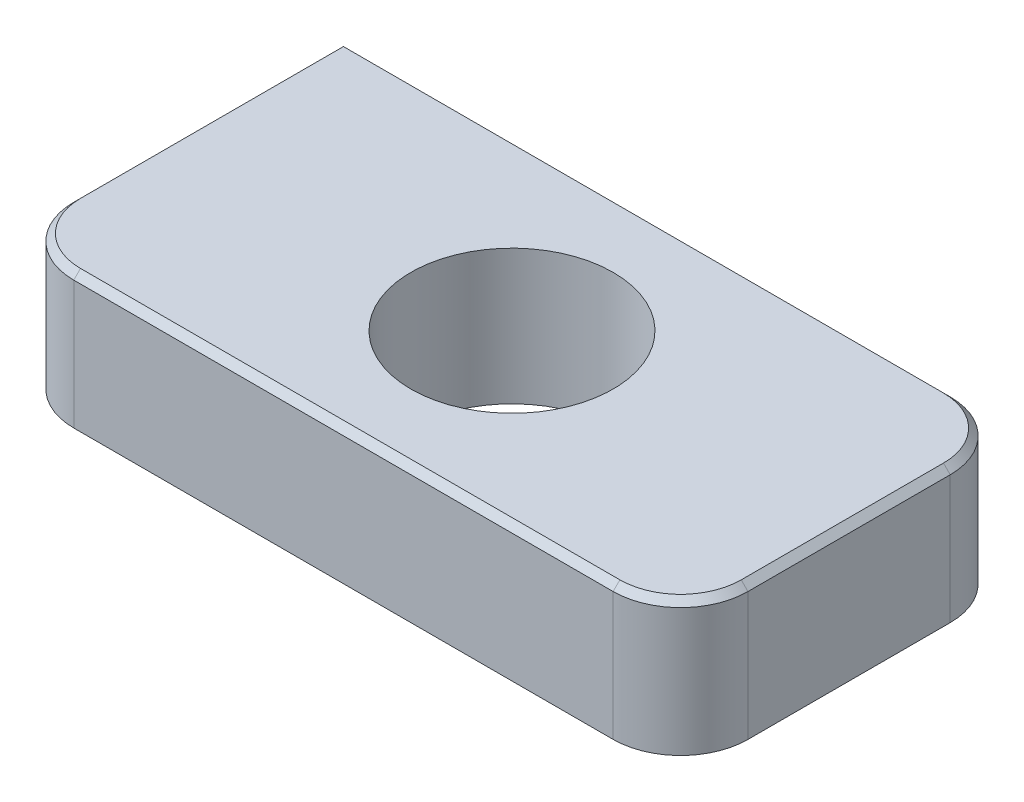
ISO-10303-21;
HEADER;
FILE_DESCRIPTION(('STEP AP214'),'2;1');
FILE_NAME('part.step','',(''),(''),'','','');
FILE_SCHEMA(('AUTOMOTIVE_DESIGN { 1 0 10303 214 1 1 1 1 }'));
ENDSEC;
DATA;
#1=APPLICATION_CONTEXT('core data for automotive mechanical design processes');
#2=APPLICATION_PROTOCOL_DEFINITION('international standard','automotive_design',2000,#1);
#3=PRODUCT_CONTEXT('',#1,'mechanical');
#4=PRODUCT('Part','Part','',(#3));
#5=PRODUCT_RELATED_PRODUCT_CATEGORY('part','',(#4));
#6=PRODUCT_DEFINITION_FORMATION('','',#4);
#7=PRODUCT_DEFINITION_CONTEXT('part definition',#1,'design');
#8=PRODUCT_DEFINITION('design','',#6,#7);
#9=PRODUCT_DEFINITION_SHAPE('','',#8);
#10=(LENGTH_UNIT() NAMED_UNIT(*) SI_UNIT(.MILLI.,.METRE.));
#11=(NAMED_UNIT(*) PLANE_ANGLE_UNIT() SI_UNIT($,.RADIAN.));
#12=(NAMED_UNIT(*) SI_UNIT($,.STERADIAN.) SOLID_ANGLE_UNIT());
#13=UNCERTAINTY_MEASURE_WITH_UNIT(LENGTH_MEASURE(1.E-05),#10,'distance_accuracy_value','');
#14=(GEOMETRIC_REPRESENTATION_CONTEXT(3) GLOBAL_UNCERTAINTY_ASSIGNED_CONTEXT((#13)) GLOBAL_UNIT_ASSIGNED_CONTEXT((#10,
#11,#12)) REPRESENTATION_CONTEXT('',''));
#15=CARTESIAN_POINT('',(0.,0.,0.));
#16=DIRECTION('',(0.,0.,1.));
#17=DIRECTION('',(1.,0.,0.));
#18=AXIS2_PLACEMENT_3D('',#15,#16,#17);
#19=CARTESIAN_POINT('',(50.,20.,-25.));
#20=DIRECTION('',(-1.,0.,0.));
#21=DIRECTION('',(0.,0.,1.));
#22=AXIS2_PLACEMENT_3D('',#19,#20,#21);
#23=PLANE('',#22);
#24=DIRECTION('',(0.,-1.,0.));
#25=VECTOR('',#24,1.);
#26=CARTESIAN_POINT('',(50.,20.,-15.));
#27=LINE('',#26,#25);
#28=CARTESIAN_POINT('',(50.,0.,-15.));
#29=VERTEX_POINT('',#28);
#30=CARTESIAN_POINT('',(50.,19.,-15.));
#31=VERTEX_POINT('',#30);
#32=EDGE_CURVE('E154',#29,#31,#27,.F.);
#33=ORIENTED_EDGE('',*,*,#32,.T.);
#34=DIRECTION('',(0.,0.,1.));
#35=VECTOR('',#34,1.);
#36=CARTESIAN_POINT('',(50.,19.,15.));
#37=LINE('',#36,#35);
#38=CARTESIAN_POINT('',(50.,19.,15.));
#39=VERTEX_POINT('',#38);
#40=EDGE_CURVE('E183',#31,#39,#37,.T.);
#41=ORIENTED_EDGE('',*,*,#40,.T.);
#42=DIRECTION('',(0.,-1.,0.));
#43=VECTOR('',#42,1.);
#44=CARTESIAN_POINT('',(50.,20.,15.));
#45=LINE('',#44,#43);
#46=CARTESIAN_POINT('',(50.,0.,15.));
#47=VERTEX_POINT('',#46);
#48=EDGE_CURVE('E152',#39,#47,#45,.T.);
#49=ORIENTED_EDGE('',*,*,#48,.T.);
#50=DIRECTION('',(0.,0.,-1.));
#51=VECTOR('',#50,1.);
#52=CARTESIAN_POINT('',(50.,0.,-25.));
#53=LINE('',#52,#51);
#54=EDGE_CURVE('E135',#47,#29,#53,.T.);
#55=ORIENTED_EDGE('',*,*,#54,.T.);
#56=EDGE_LOOP('',(#33,#41,#49,#55));
#57=FACE_BOUND('',#56,.T.);
#58=ADVANCED_FACE('F33',(#57),#23,.F.);
#59=CARTESIAN_POINT('',(-50.,20.,-25.));
#60=DIRECTION('',(0.,0.,1.));
#61=DIRECTION('',(1.,0.,0.));
#62=AXIS2_PLACEMENT_3D('',#59,#60,#61);
#63=PLANE('',#62);
#64=DIRECTION('',(0.,-1.,0.));
#65=VECTOR('',#64,1.);
#66=CARTESIAN_POINT('',(-50.,20.,-25.));
#67=LINE('',#66,#65);
#68=CARTESIAN_POINT('',(-50.,19.,-25.));
#69=VERTEX_POINT('',#68);
#70=CARTESIAN_POINT('',(-50.,0.,-25.));
#71=VERTEX_POINT('',#70);
#72=EDGE_CURVE('E114',#69,#71,#67,.T.);
#73=ORIENTED_EDGE('',*,*,#72,.F.);
#74=DIRECTION('',(1.,0.,0.));
#75=VECTOR('',#74,1.);
#76=CARTESIAN_POINT('',(40.,19.,-25.));
#77=LINE('',#76,#75);
#78=CARTESIAN_POINT('',(40.,19.,-25.));
#79=VERTEX_POINT('',#78);
#80=EDGE_CURVE('E178',#69,#79,#77,.T.);
#81=ORIENTED_EDGE('',*,*,#80,.T.);
#82=DIRECTION('',(0.,-1.,0.));
#83=VECTOR('',#82,1.);
#84=CARTESIAN_POINT('',(40.,20.,-25.));
#85=LINE('',#84,#83);
#86=CARTESIAN_POINT('',(40.,0.,-25.));
#87=VERTEX_POINT('',#86);
#88=EDGE_CURVE('E126',#79,#87,#85,.T.);
#89=ORIENTED_EDGE('',*,*,#88,.T.);
#90=DIRECTION('',(-1.,0.,0.));
#91=VECTOR('',#90,1.);
#92=CARTESIAN_POINT('',(-50.,0.,-25.));
#93=LINE('',#92,#91);
#94=EDGE_CURVE('E130',#87,#71,#93,.T.);
#95=ORIENTED_EDGE('',*,*,#94,.T.);
#96=EDGE_LOOP('',(#73,#81,#89,#95));
#97=FACE_BOUND('',#96,.T.);
#98=ADVANCED_FACE('F131',(#97),#63,.F.);
#99=CARTESIAN_POINT('',(-50.,20.,-25.));
#100=DIRECTION('',(1.,0.,0.));
#101=DIRECTION('',(0.,0.,-1.));
#102=AXIS2_PLACEMENT_3D('',#99,#100,#101);
#103=PLANE('',#102);
#104=DIRECTION('',(0.,-1.,0.));
#105=VECTOR('',#104,1.);
#106=CARTESIAN_POINT('',(-50.,20.,15.));
#107=LINE('',#106,#105);
#108=CARTESIAN_POINT('',(-50.,0.,15.));
#109=VERTEX_POINT('',#108);
#110=CARTESIAN_POINT('',(-50.,19.,15.));
#111=VERTEX_POINT('',#110);
#112=EDGE_CURVE('E161',#109,#111,#107,.F.);
#113=ORIENTED_EDGE('',*,*,#112,.T.);
#114=DIRECTION('',(0.,0.,-1.));
#115=VECTOR('',#114,1.);
#116=CARTESIAN_POINT('',(-50.,19.,-25.));
#117=LINE('',#116,#115);
#118=EDGE_CURVE('E122',#111,#69,#117,.T.);
#119=ORIENTED_EDGE('',*,*,#118,.T.);
#120=ORIENTED_EDGE('',*,*,#72,.T.);
#121=DIRECTION('',(0.,0.,1.));
#122=VECTOR('',#121,1.);
#123=CARTESIAN_POINT('',(-50.,0.,-25.));
#124=LINE('',#123,#122);
#125=EDGE_CURVE('E119',#71,#109,#124,.T.);
#126=ORIENTED_EDGE('',*,*,#125,.T.);
#127=EDGE_LOOP('',(#113,#119,#120,#126));
#128=FACE_BOUND('',#127,.T.);
#129=ADVANCED_FACE('F117',(#128),#103,.F.);
#130=CARTESIAN_POINT('',(-50.,20.,25.));
#131=DIRECTION('',(0.,0.,-1.));
#132=DIRECTION('',(-1.,0.,0.));
#133=AXIS2_PLACEMENT_3D('',#130,#131,#132);
#134=PLANE('',#133);
#135=DIRECTION('',(0.,-1.,0.));
#136=VECTOR('',#135,1.);
#137=CARTESIAN_POINT('',(40.,20.,25.));
#138=LINE('',#137,#136);
#139=CARTESIAN_POINT('',(40.,0.,25.));
#140=VERTEX_POINT('',#139);
#141=CARTESIAN_POINT('',(40.,19.,25.));
#142=VERTEX_POINT('',#141);
#143=EDGE_CURVE('E159',#140,#142,#138,.F.);
#144=ORIENTED_EDGE('',*,*,#143,.T.);
#145=DIRECTION('',(-1.,0.,0.));
#146=VECTOR('',#145,1.);
#147=CARTESIAN_POINT('',(-40.,19.,25.));
#148=LINE('',#147,#146);
#149=CARTESIAN_POINT('',(-40.,19.,25.));
#150=VERTEX_POINT('',#149);
#151=EDGE_CURVE('E11',#142,#150,#148,.T.);
#152=ORIENTED_EDGE('',*,*,#151,.T.);
#153=DIRECTION('',(0.,-1.,0.));
#154=VECTOR('',#153,1.);
#155=CARTESIAN_POINT('',(-40.,20.,25.));
#156=LINE('',#155,#154);
#157=CARTESIAN_POINT('',(-40.,0.,25.));
#158=VERTEX_POINT('',#157);
#159=EDGE_CURVE('E157',#150,#158,#156,.T.);
#160=ORIENTED_EDGE('',*,*,#159,.T.);
#161=DIRECTION('',(1.,0.,0.));
#162=VECTOR('',#161,1.);
#163=CARTESIAN_POINT('',(-50.,0.,25.));
#164=LINE('',#163,#162);
#165=EDGE_CURVE('E127',#158,#140,#164,.T.);
#166=ORIENTED_EDGE('',*,*,#165,.T.);
#167=EDGE_LOOP('',(#144,#152,#160,#166));
#168=FACE_BOUND('',#167,.T.);
#169=ADVANCED_FACE('F254',(#168),#134,.F.);
#170=CARTESIAN_POINT('',(0.,20.,0.));
#171=DIRECTION('',(0.,1.,0.));
#172=DIRECTION('',(0.,0.,1.));
#173=AXIS2_PLACEMENT_3D('',#170,#171,#172);
#174=PLANE('',#173);
#175=CARTESIAN_POINT('',(40.,20.,-15.));
#176=DIRECTION('',(0.,1.,0.));
#177=DIRECTION('',(0.,0.,1.));
#178=AXIS2_PLACEMENT_3D('',#175,#176,#177);
#179=CIRCLE('',#178,9.);
#180=CARTESIAN_POINT('',(49.,20.,-15.));
#181=VERTEX_POINT('',#180);
#182=CARTESIAN_POINT('',(40.,20.,-24.));
#183=VERTEX_POINT('',#182);
#184=EDGE_CURVE('E173',#181,#183,#179,.T.);
#185=ORIENTED_EDGE('',*,*,#184,.T.);
#186=DIRECTION('',(-1.,0.,0.));
#187=VECTOR('',#186,1.);
#188=CARTESIAN_POINT('',(-50.,20.,-24.));
#189=LINE('',#188,#187);
#190=CARTESIAN_POINT('',(-49.,20.,-24.));
#191=VERTEX_POINT('',#190);
#192=EDGE_CURVE('E175',#183,#191,#189,.T.);
#193=ORIENTED_EDGE('',*,*,#192,.T.);
#194=DIRECTION('',(0.,0.,1.));
#195=VECTOR('',#194,1.);
#196=CARTESIAN_POINT('',(-49.,20.,15.));
#197=LINE('',#196,#195);
#198=CARTESIAN_POINT('',(-49.,20.,15.));
#199=VERTEX_POINT('',#198);
#200=EDGE_CURVE('E171',#191,#199,#197,.T.);
#201=ORIENTED_EDGE('',*,*,#200,.T.);
#202=CARTESIAN_POINT('',(-40.,20.,15.));
#203=DIRECTION('',(0.,1.,0.));
#204=DIRECTION('',(0.,0.,1.));
#205=AXIS2_PLACEMENT_3D('',#202,#203,#204);
#206=CIRCLE('',#205,9.);
#207=CARTESIAN_POINT('',(-40.,20.,24.));
#208=VERTEX_POINT('',#207);
#209=EDGE_CURVE('E167',#199,#208,#206,.T.);
#210=ORIENTED_EDGE('',*,*,#209,.T.);
#211=DIRECTION('',(1.,0.,0.));
#212=VECTOR('',#211,1.);
#213=CARTESIAN_POINT('',(40.,20.,24.));
#214=LINE('',#213,#212);
#215=CARTESIAN_POINT('',(40.,20.,24.));
#216=VERTEX_POINT('',#215);
#217=EDGE_CURVE('E163',#208,#216,#214,.T.);
#218=ORIENTED_EDGE('',*,*,#217,.T.);
#219=CARTESIAN_POINT('',(40.,20.,15.));
#220=DIRECTION('',(0.,1.,0.));
#221=DIRECTION('',(0.,0.,1.));
#222=AXIS2_PLACEMENT_3D('',#219,#220,#221);
#223=CIRCLE('',#222,9.);
#224=CARTESIAN_POINT('',(49.,20.,15.));
#225=VERTEX_POINT('',#224);
#226=EDGE_CURVE('E165',#216,#225,#223,.T.);
#227=ORIENTED_EDGE('',*,*,#226,.T.);
#228=DIRECTION('',(0.,0.,-1.));
#229=VECTOR('',#228,1.);
#230=CARTESIAN_POINT('',(49.,20.,-15.));
#231=LINE('',#230,#229);
#232=EDGE_CURVE('E169',#225,#181,#231,.T.);
#233=ORIENTED_EDGE('',*,*,#232,.T.);
#234=EDGE_LOOP('',(#185,#193,#201,#210,#218,#227,#233));
#235=FACE_BOUND('',#234,.T.);
#236=CARTESIAN_POINT('',(0.,20.,0.));
#237=DIRECTION('',(0.,1.,0.));
#238=DIRECTION('',(0.,0.,1.));
#239=AXIS2_PLACEMENT_3D('',#236,#237,#238);
#240=CIRCLE('',#239,15.);
#241=CARTESIAN_POINT('',(0.,20.,15.));
#242=VERTEX_POINT('',#241);
#243=EDGE_CURVE('E207',#242,#242,#240,.T.);
#244=ORIENTED_EDGE('',*,*,#243,.F.);
#245=EDGE_LOOP('',(#244));
#246=FACE_BOUND('',#245,.T.);
#247=ADVANCED_FACE('F241',(#235,#246),#174,.T.);
#248=CARTESIAN_POINT('',(0.,0.,0.));
#249=DIRECTION('',(0.,1.,0.));
#250=DIRECTION('',(0.,0.,1.));
#251=AXIS2_PLACEMENT_3D('',#248,#249,#250);
#252=PLANE('',#251);
#253=CARTESIAN_POINT('',(0.,0.,0.));
#254=DIRECTION('',(0.,1.,0.));
#255=DIRECTION('',(0.,0.,1.));
#256=AXIS2_PLACEMENT_3D('',#253,#254,#255);
#257=CIRCLE('',#256,15.);
#258=CARTESIAN_POINT('',(0.,0.,15.));
#259=VERTEX_POINT('',#258);
#260=EDGE_CURVE('E212',#259,#259,#257,.T.);
#261=ORIENTED_EDGE('',*,*,#260,.T.);
#262=EDGE_LOOP('',(#261));
#263=FACE_BOUND('',#262,.T.);
#264=ORIENTED_EDGE('',*,*,#94,.F.);
#265=CARTESIAN_POINT('',(40.,0.,-15.));
#266=DIRECTION('',(0.,1.,0.));
#267=DIRECTION('',(0.,0.,1.));
#268=AXIS2_PLACEMENT_3D('',#265,#266,#267);
#269=CIRCLE('',#268,10.);
#270=EDGE_CURVE('E150',#87,#29,#269,.F.);
#271=ORIENTED_EDGE('',*,*,#270,.T.);
#272=ORIENTED_EDGE('',*,*,#54,.F.);
#273=CARTESIAN_POINT('',(40.,0.,15.));
#274=DIRECTION('',(0.,1.,0.));
#275=DIRECTION('',(0.,0.,1.));
#276=AXIS2_PLACEMENT_3D('',#273,#274,#275);
#277=CIRCLE('',#276,10.);
#278=EDGE_CURVE('E148',#47,#140,#277,.F.);
#279=ORIENTED_EDGE('',*,*,#278,.T.);
#280=ORIENTED_EDGE('',*,*,#165,.F.);
#281=CARTESIAN_POINT('',(-40.,0.,15.));
#282=DIRECTION('',(0.,1.,0.));
#283=DIRECTION('',(0.,0.,1.));
#284=AXIS2_PLACEMENT_3D('',#281,#282,#283);
#285=CIRCLE('',#284,10.);
#286=EDGE_CURVE('E140',#158,#109,#285,.F.);
#287=ORIENTED_EDGE('',*,*,#286,.T.);
#288=ORIENTED_EDGE('',*,*,#125,.F.);
#289=EDGE_LOOP('',(#264,#271,#272,#279,#280,#287,#288));
#290=FACE_BOUND('',#289,.T.);
#291=ADVANCED_FACE('F137',(#263,#290),#252,.F.);
#292=CARTESIAN_POINT('',(0.,0.,0.));
#293=DIRECTION('',(0.,1.,0.));
#294=DIRECTION('',(0.,0.,1.));
#295=AXIS2_PLACEMENT_3D('',#292,#293,#294);
#296=CYLINDRICAL_SURFACE('',#295,15.);
#297=ORIENTED_EDGE('',*,*,#260,.F.);
#298=EDGE_LOOP('',(#297));
#299=FACE_BOUND('',#298,.T.);
#300=ORIENTED_EDGE('',*,*,#243,.T.);
#301=EDGE_LOOP('',(#300));
#302=FACE_BOUND('',#301,.T.);
#303=ADVANCED_FACE('F274',(#299,#302),#296,.F.);
#304=CARTESIAN_POINT('',(40.,20.,-15.));
#305=DIRECTION('',(0.,-1.,0.));
#306=DIRECTION('',(0.,0.,-1.));
#307=AXIS2_PLACEMENT_3D('',#304,#305,#306);
#308=CYLINDRICAL_SURFACE('',#307,10.);
#309=ORIENTED_EDGE('',*,*,#88,.F.);
#310=CARTESIAN_POINT('',(40.,19.,-15.));
#311=DIRECTION('',(0.,1.,0.));
#312=DIRECTION('',(0.,0.,1.));
#313=AXIS2_PLACEMENT_3D('',#310,#311,#312);
#314=CIRCLE('',#313,10.);
#315=EDGE_CURVE('E180',#79,#31,#314,.F.);
#316=ORIENTED_EDGE('',*,*,#315,.T.);
#317=ORIENTED_EDGE('',*,*,#32,.F.);
#318=ORIENTED_EDGE('',*,*,#270,.F.);
#319=EDGE_LOOP('',(#309,#316,#317,#318));
#320=FACE_BOUND('',#319,.T.);
#321=ADVANCED_FACE('F224',(#320),#308,.T.);
#322=CARTESIAN_POINT('',(40.,20.,15.));
#323=DIRECTION('',(0.,-1.,0.));
#324=DIRECTION('',(0.,0.,-1.));
#325=AXIS2_PLACEMENT_3D('',#322,#323,#324);
#326=CYLINDRICAL_SURFACE('',#325,10.);
#327=ORIENTED_EDGE('',*,*,#48,.F.);
#328=CARTESIAN_POINT('',(40.,19.,15.));
#329=DIRECTION('',(0.,1.,0.));
#330=DIRECTION('',(0.,0.,1.));
#331=AXIS2_PLACEMENT_3D('',#328,#329,#330);
#332=CIRCLE('',#331,10.);
#333=EDGE_CURVE('E42',#39,#142,#332,.F.);
#334=ORIENTED_EDGE('',*,*,#333,.T.);
#335=ORIENTED_EDGE('',*,*,#143,.F.);
#336=ORIENTED_EDGE('',*,*,#278,.F.);
#337=EDGE_LOOP('',(#327,#334,#335,#336));
#338=FACE_BOUND('',#337,.T.);
#339=ADVANCED_FACE('F245',(#338),#326,.T.);
#340=CARTESIAN_POINT('',(-40.,20.,15.));
#341=DIRECTION('',(0.,-1.,0.));
#342=DIRECTION('',(0.,0.,-1.));
#343=AXIS2_PLACEMENT_3D('',#340,#341,#342);
#344=CYLINDRICAL_SURFACE('',#343,10.);
#345=ORIENTED_EDGE('',*,*,#159,.F.);
#346=CARTESIAN_POINT('',(-40.,19.,15.));
#347=DIRECTION('',(0.,1.,0.));
#348=DIRECTION('',(0.,0.,1.));
#349=AXIS2_PLACEMENT_3D('',#346,#347,#348);
#350=CIRCLE('',#349,10.);
#351=EDGE_CURVE('E185',#150,#111,#350,.F.);
#352=ORIENTED_EDGE('',*,*,#351,.T.);
#353=ORIENTED_EDGE('',*,*,#112,.F.);
#354=ORIENTED_EDGE('',*,*,#286,.F.);
#355=EDGE_LOOP('',(#345,#352,#353,#354));
#356=FACE_BOUND('',#355,.T.);
#357=ADVANCED_FACE('F253',(#356),#344,.T.);
#358=CARTESIAN_POINT('',(40.,20.,15.));
#359=DIRECTION('',(0.,-1.,0.));
#360=DIRECTION('',(0.,0.,-1.));
#361=AXIS2_PLACEMENT_3D('',#358,#359,#360);
#362=CONICAL_SURFACE('',#361,9.,0.785398163397447);
#363=DIRECTION('',(0.707106781186547,-0.707106781186547,0.));
#364=VECTOR('',#363,1.);
#365=CARTESIAN_POINT('',(49.,20.,15.));
#366=LINE('',#365,#364);
#367=EDGE_CURVE('E200',#225,#39,#366,.T.);
#368=ORIENTED_EDGE('',*,*,#367,.F.);
#369=ORIENTED_EDGE('',*,*,#226,.F.);
#370=DIRECTION('',(0.,0.707106781186547,-0.707106781186547));
#371=VECTOR('',#370,1.);
#372=CARTESIAN_POINT('',(40.,19.,25.));
#373=LINE('',#372,#371);
#374=EDGE_CURVE('E37',#142,#216,#373,.T.);
#375=ORIENTED_EDGE('',*,*,#374,.F.);
#376=ORIENTED_EDGE('',*,*,#333,.F.);
#377=EDGE_LOOP('',(#368,#369,#375,#376));
#378=FACE_BOUND('',#377,.T.);
#379=ADVANCED_FACE('F35',(#378),#362,.T.);
#380=CARTESIAN_POINT('',(0.,20.,24.));
#381=DIRECTION('',(0.,0.707106781186547,0.707106781186548));
#382=DIRECTION('',(-1.,0.,0.));
#383=AXIS2_PLACEMENT_3D('',#380,#381,#382);
#384=PLANE('',#383);
#385=ORIENTED_EDGE('',*,*,#374,.T.);
#386=ORIENTED_EDGE('',*,*,#217,.F.);
#387=DIRECTION('',(0.,0.707106781186547,-0.707106781186547));
#388=VECTOR('',#387,1.);
#389=CARTESIAN_POINT('',(-40.,19.,25.));
#390=LINE('',#389,#388);
#391=EDGE_CURVE('E198',#150,#208,#390,.T.);
#392=ORIENTED_EDGE('',*,*,#391,.F.);
#393=ORIENTED_EDGE('',*,*,#151,.F.);
#394=EDGE_LOOP('',(#385,#386,#392,#393));
#395=FACE_BOUND('',#394,.T.);
#396=ADVANCED_FACE('F248',(#395),#384,.T.);
#397=CARTESIAN_POINT('',(49.,20.,0.));
#398=DIRECTION('',(0.707106781186547,0.707106781186547,0.));
#399=DIRECTION('',(0.,0.,1.));
#400=AXIS2_PLACEMENT_3D('',#397,#398,#399);
#401=PLANE('',#400);
#402=ORIENTED_EDGE('',*,*,#367,.T.);
#403=ORIENTED_EDGE('',*,*,#40,.F.);
#404=DIRECTION('',(0.707106781186547,-0.707106781186547,0.));
#405=VECTOR('',#404,1.);
#406=CARTESIAN_POINT('',(49.,20.,-15.));
#407=LINE('',#406,#405);
#408=EDGE_CURVE('E195',#181,#31,#407,.T.);
#409=ORIENTED_EDGE('',*,*,#408,.F.);
#410=ORIENTED_EDGE('',*,*,#232,.F.);
#411=EDGE_LOOP('',(#402,#403,#409,#410));
#412=FACE_BOUND('',#411,.T.);
#413=ADVANCED_FACE('F244',(#412),#401,.T.);
#414=CARTESIAN_POINT('',(-40.,20.,15.));
#415=DIRECTION('',(0.,-1.,0.));
#416=DIRECTION('',(0.,0.,-1.));
#417=AXIS2_PLACEMENT_3D('',#414,#415,#416);
#418=CONICAL_SURFACE('',#417,9.,0.785398163397447);
#419=ORIENTED_EDGE('',*,*,#391,.T.);
#420=ORIENTED_EDGE('',*,*,#209,.F.);
#421=DIRECTION('',(0.707106781186547,0.707106781186547,0.));
#422=VECTOR('',#421,1.);
#423=CARTESIAN_POINT('',(-50.,19.,15.));
#424=LINE('',#423,#422);
#425=EDGE_CURVE('E192',#111,#199,#424,.T.);
#426=ORIENTED_EDGE('',*,*,#425,.F.);
#427=ORIENTED_EDGE('',*,*,#351,.F.);
#428=EDGE_LOOP('',(#419,#420,#426,#427));
#429=FACE_BOUND('',#428,.T.);
#430=ADVANCED_FACE('F251',(#429),#418,.T.);
#431=CARTESIAN_POINT('',(40.,20.,-15.));
#432=DIRECTION('',(0.,-1.,0.));
#433=DIRECTION('',(0.,0.,-1.));
#434=AXIS2_PLACEMENT_3D('',#431,#432,#433);
#435=CONICAL_SURFACE('',#434,9.,0.785398163397447);
#436=ORIENTED_EDGE('',*,*,#408,.T.);
#437=ORIENTED_EDGE('',*,*,#315,.F.);
#438=DIRECTION('',(0.,-0.707106781186547,-0.707106781186547));
#439=VECTOR('',#438,1.);
#440=CARTESIAN_POINT('',(40.,20.,-24.));
#441=LINE('',#440,#439);
#442=EDGE_CURVE('E190',#183,#79,#441,.T.);
#443=ORIENTED_EDGE('',*,*,#442,.F.);
#444=ORIENTED_EDGE('',*,*,#184,.F.);
#445=EDGE_LOOP('',(#436,#437,#443,#444));
#446=FACE_BOUND('',#445,.T.);
#447=ADVANCED_FACE('F228',(#446),#435,.T.);
#448=CARTESIAN_POINT('',(-49.,20.,0.));
#449=DIRECTION('',(-0.707106781186547,0.707106781186547,0.));
#450=DIRECTION('',(0.,0.,-1.));
#451=AXIS2_PLACEMENT_3D('',#448,#449,#450);
#452=PLANE('',#451);
#453=ORIENTED_EDGE('',*,*,#425,.T.);
#454=ORIENTED_EDGE('',*,*,#200,.F.);
#455=DIRECTION('',(-0.577350269189626,-0.577350269189626,-0.577350269189625));
#456=VECTOR('',#455,1.);
#457=CARTESIAN_POINT('',(-41.,28.,-16.));
#458=LINE('',#457,#456);
#459=EDGE_CURVE('E188',#69,#191,#458,.F.);
#460=ORIENTED_EDGE('',*,*,#459,.F.);
#461=ORIENTED_EDGE('',*,*,#118,.F.);
#462=EDGE_LOOP('',(#453,#454,#460,#461));
#463=FACE_BOUND('',#462,.T.);
#464=ADVANCED_FACE('F237',(#463),#452,.T.);
#465=CARTESIAN_POINT('',(0.,20.,-24.));
#466=DIRECTION('',(0.,0.707106781186547,-0.707106781186548));
#467=DIRECTION('',(1.,0.,0.));
#468=AXIS2_PLACEMENT_3D('',#465,#466,#467);
#469=PLANE('',#468);
#470=ORIENTED_EDGE('',*,*,#442,.T.);
#471=ORIENTED_EDGE('',*,*,#80,.F.);
#472=ORIENTED_EDGE('',*,*,#459,.T.);
#473=ORIENTED_EDGE('',*,*,#192,.F.);
#474=EDGE_LOOP('',(#470,#471,#472,#473));
#475=FACE_BOUND('',#474,.T.);
#476=ADVANCED_FACE('F234',(#475),#469,.T.);
#477=CLOSED_SHELL('',(#58,#98,#129,#169,#247,#291,#303,#321,#339,#357,#379,#396,#413,#430,#447,
#464,#476));
#478=MANIFOLD_SOLID_BREP('B2',#477);
#479=ADVANCED_BREP_SHAPE_REPRESENTATION('',(#18,#478),#14);
#480=SHAPE_DEFINITION_REPRESENTATION(#9,#479);
ENDSEC;
END-ISO-10303-21;
